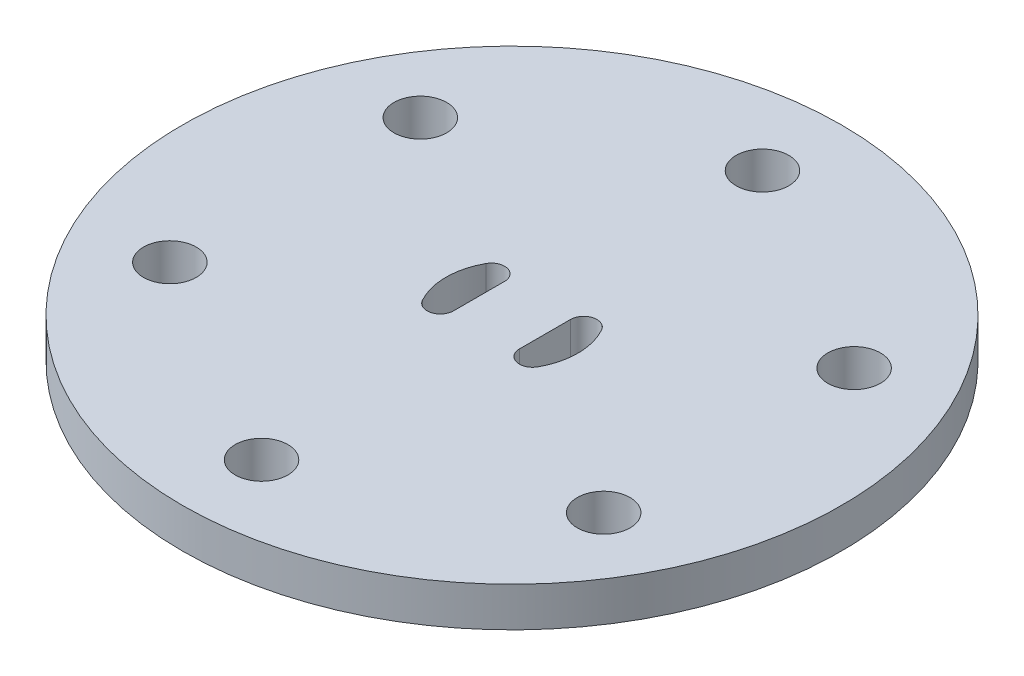
ISO-10303-21;
HEADER;
FILE_DESCRIPTION(('STEP AP214'),'2;1');
FILE_NAME('part.step','',(''),(''),'','','');
FILE_SCHEMA(('AUTOMOTIVE_DESIGN { 1 0 10303 214 1 1 1 1 }'));
ENDSEC;
DATA;
#1=APPLICATION_CONTEXT('core data for automotive mechanical design processes');
#2=APPLICATION_PROTOCOL_DEFINITION('international standard','automotive_design',2000,#1);
#3=PRODUCT_CONTEXT('',#1,'mechanical');
#4=PRODUCT('Part','Part','',(#3));
#5=PRODUCT_RELATED_PRODUCT_CATEGORY('part','',(#4));
#6=PRODUCT_DEFINITION_FORMATION('','',#4);
#7=PRODUCT_DEFINITION_CONTEXT('part definition',#1,'design');
#8=PRODUCT_DEFINITION('design','',#6,#7);
#9=PRODUCT_DEFINITION_SHAPE('','',#8);
#10=(LENGTH_UNIT() NAMED_UNIT(*) SI_UNIT(.MILLI.,.METRE.));
#11=(NAMED_UNIT(*) PLANE_ANGLE_UNIT() SI_UNIT($,.RADIAN.));
#12=(NAMED_UNIT(*) SI_UNIT($,.STERADIAN.) SOLID_ANGLE_UNIT());
#13=UNCERTAINTY_MEASURE_WITH_UNIT(LENGTH_MEASURE(1.E-05),#10,'distance_accuracy_value','');
#14=(GEOMETRIC_REPRESENTATION_CONTEXT(3) GLOBAL_UNCERTAINTY_ASSIGNED_CONTEXT((#13)) GLOBAL_UNIT_ASSIGNED_CONTEXT((#10,
#11,#12)) REPRESENTATION_CONTEXT('',''));
#15=CARTESIAN_POINT('',(0.,0.,0.));
#16=DIRECTION('',(0.,0.,1.));
#17=DIRECTION('',(1.,0.,0.));
#18=AXIS2_PLACEMENT_3D('',#15,#16,#17);
#19=CARTESIAN_POINT('',(0.,3.,0.));
#20=DIRECTION('',(0.,-1.,0.));
#21=DIRECTION('',(0.,0.,-1.));
#22=AXIS2_PLACEMENT_3D('',#19,#20,#21);
#23=CYLINDRICAL_SURFACE('',#22,5.);
#24=CARTESIAN_POINT('',(0.,3.,0.));
#25=DIRECTION('',(0.,1.,0.));
#26=DIRECTION('',(0.,0.,1.));
#27=AXIS2_PLACEMENT_3D('',#24,#25,#26);
#28=CIRCLE('',#27,5.);
#29=CARTESIAN_POINT('',(4.375,3.,2.42061459137964));
#30=VERTEX_POINT('',#29);
#31=CARTESIAN_POINT('',(4.375,3.,-2.42061459137964));
#32=VERTEX_POINT('',#31);
#33=EDGE_CURVE('E111',#30,#32,#28,.T.);
#34=ORIENTED_EDGE('',*,*,#33,.T.);
#35=DIRECTION('',(0.,-1.,0.));
#36=VECTOR('',#35,1.);
#37=CARTESIAN_POINT('',(4.375,3.,-2.42061459137964));
#38=LINE('',#37,#36);
#39=CARTESIAN_POINT('',(4.375,0.,-2.42061459137964));
#40=VERTEX_POINT('',#39);
#41=EDGE_CURVE('E146',#32,#40,#38,.T.);
#42=ORIENTED_EDGE('',*,*,#41,.T.);
#43=CARTESIAN_POINT('',(0.,0.,0.));
#44=DIRECTION('',(0.,1.,0.));
#45=DIRECTION('',(0.,0.,1.));
#46=AXIS2_PLACEMENT_3D('',#43,#44,#45);
#47=CIRCLE('',#46,5.);
#48=CARTESIAN_POINT('',(4.375,0.,2.42061459137964));
#49=VERTEX_POINT('',#48);
#50=EDGE_CURVE('E200',#49,#40,#47,.T.);
#51=ORIENTED_EDGE('',*,*,#50,.F.);
#52=DIRECTION('',(0.,-1.,0.));
#53=VECTOR('',#52,1.);
#54=CARTESIAN_POINT('',(4.375,3.,2.42061459137964));
#55=LINE('',#54,#53);
#56=EDGE_CURVE('E137',#49,#30,#55,.F.);
#57=ORIENTED_EDGE('',*,*,#56,.T.);
#58=EDGE_LOOP('',(#34,#42,#51,#57));
#59=FACE_BOUND('',#58,.T.);
#60=ADVANCED_FACE('F39',(#59),#23,.F.);
#61=CARTESIAN_POINT('',(0.,3.,0.));
#62=DIRECTION('',(0.,1.,0.));
#63=DIRECTION('',(0.,0.,1.));
#64=AXIS2_PLACEMENT_3D('',#61,#62,#63);
#65=PLANE('',#64);
#66=ORIENTED_EDGE('',*,*,#33,.F.);
#67=CARTESIAN_POINT('',(3.5,3.,1.93649167310371));
#68=DIRECTION('',(0.,1.,0.));
#69=DIRECTION('',(0.,0.,1.));
#70=AXIS2_PLACEMENT_3D('',#67,#68,#69);
#71=CIRCLE('',#70,1.);
#72=CARTESIAN_POINT('',(2.5,3.,1.93649167310371));
#73=VERTEX_POINT('',#72);
#74=EDGE_CURVE('E105',#30,#73,#71,.F.);
#75=ORIENTED_EDGE('',*,*,#74,.T.);
#76=DIRECTION('',(0.,0.,-1.));
#77=VECTOR('',#76,1.);
#78=CARTESIAN_POINT('',(2.5,3.,6.));
#79=LINE('',#78,#77);
#80=CARTESIAN_POINT('',(2.5,3.,-1.93649167310371));
#81=VERTEX_POINT('',#80);
#82=EDGE_CURVE('E109',#73,#81,#79,.T.);
#83=ORIENTED_EDGE('',*,*,#82,.T.);
#84=CARTESIAN_POINT('',(3.5,3.,-1.93649167310371));
#85=DIRECTION('',(0.,1.,0.));
#86=DIRECTION('',(0.,0.,1.));
#87=AXIS2_PLACEMENT_3D('',#84,#85,#86);
#88=CIRCLE('',#87,1.);
#89=EDGE_CURVE('E162',#81,#32,#88,.F.);
#90=ORIENTED_EDGE('',*,*,#89,.T.);
#91=EDGE_LOOP('',(#66,#75,#83,#90));
#92=FACE_BOUND('',#91,.T.);
#93=CARTESIAN_POINT('',(-4.375,3.,-2.42061459137963));
#94=VERTEX_POINT('',#93);
#95=CARTESIAN_POINT('',(-4.375,3.,2.42061459137963));
#96=VERTEX_POINT('',#95);
#97=EDGE_CURVE('E195',#94,#96,#28,.T.);
#98=ORIENTED_EDGE('',*,*,#97,.F.);
#99=CARTESIAN_POINT('',(-3.5,3.,-1.93649167310371));
#100=DIRECTION('',(0.,1.,0.));
#101=DIRECTION('',(0.,0.,1.));
#102=AXIS2_PLACEMENT_3D('',#99,#100,#101);
#103=CIRCLE('',#102,1.);
#104=CARTESIAN_POINT('',(-2.5,3.,-1.93649167310371));
#105=VERTEX_POINT('',#104);
#106=EDGE_CURVE('E11',#94,#105,#103,.F.);
#107=ORIENTED_EDGE('',*,*,#106,.T.);
#108=DIRECTION('',(0.,0.,1.));
#109=VECTOR('',#108,1.);
#110=CARTESIAN_POINT('',(-2.5,3.,6.));
#111=LINE('',#110,#109);
#112=CARTESIAN_POINT('',(-2.5,3.,1.93649167310371));
#113=VERTEX_POINT('',#112);
#114=EDGE_CURVE('E129',#105,#113,#111,.T.);
#115=ORIENTED_EDGE('',*,*,#114,.T.);
#116=CARTESIAN_POINT('',(-3.5,3.,1.93649167310371));
#117=DIRECTION('',(0.,1.,0.));
#118=DIRECTION('',(0.,0.,1.));
#119=AXIS2_PLACEMENT_3D('',#116,#117,#118);
#120=CIRCLE('',#119,1.);
#121=EDGE_CURVE('E116',#113,#96,#120,.F.);
#122=ORIENTED_EDGE('',*,*,#121,.T.);
#123=EDGE_LOOP('',(#98,#107,#115,#122));
#124=FACE_BOUND('',#123,.T.);
#125=CARTESIAN_POINT('',(-16.4544826719031,3.,9.50000000000071));
#126=DIRECTION('',(0.,1.,0.));
#127=DIRECTION('',(0.,0.,1.));
#128=AXIS2_PLACEMENT_3D('',#125,#126,#127);
#129=CIRCLE('',#128,2.00000000000154);
#130=CARTESIAN_POINT('',(-16.4544826719031,3.,11.5000000000022));
#131=VERTEX_POINT('',#130);
#132=EDGE_CURVE('E297',#131,#131,#129,.T.);
#133=ORIENTED_EDGE('',*,*,#132,.F.);
#134=EDGE_LOOP('',(#133));
#135=FACE_BOUND('',#134,.T.);
#136=CARTESIAN_POINT('',(16.4544826719055,3.,9.4999999999993));
#137=DIRECTION('',(0.,1.,0.));
#138=DIRECTION('',(0.,0.,1.));
#139=AXIS2_PLACEMENT_3D('',#136,#137,#138);
#140=CIRCLE('',#139,2.00000000000104);
#141=CARTESIAN_POINT('',(16.4544826719055,3.,11.5000000000003));
#142=VERTEX_POINT('',#141);
#143=EDGE_CURVE('E313',#142,#142,#140,.T.);
#144=ORIENTED_EDGE('',*,*,#143,.F.);
#145=EDGE_LOOP('',(#144));
#146=FACE_BOUND('',#145,.T.);
#147=CARTESIAN_POINT('',(0.,3.,0.));
#148=DIRECTION('',(0.,1.,0.));
#149=DIRECTION('',(0.,0.,1.));
#150=AXIS2_PLACEMENT_3D('',#147,#148,#149);
#151=CIRCLE('',#150,25.);
#152=CARTESIAN_POINT('',(0.,3.,25.));
#153=VERTEX_POINT('',#152);
#154=EDGE_CURVE('E133',#153,#153,#151,.T.);
#155=ORIENTED_EDGE('',*,*,#154,.T.);
#156=EDGE_LOOP('',(#155));
#157=FACE_BOUND('',#156,.T.);
#158=CARTESIAN_POINT('',(0.,3.,-19.));
#159=DIRECTION('',(0.,1.,0.));
#160=DIRECTION('',(0.,0.,1.));
#161=AXIS2_PLACEMENT_3D('',#158,#159,#160);
#162=CIRCLE('',#161,2.);
#163=CARTESIAN_POINT('',(0.,3.,-17.));
#164=VERTEX_POINT('',#163);
#165=EDGE_CURVE('E213',#164,#164,#162,.T.);
#166=ORIENTED_EDGE('',*,*,#165,.F.);
#167=EDGE_LOOP('',(#166));
#168=FACE_BOUND('',#167,.T.);
#169=CARTESIAN_POINT('',(16.4544826719047,3.,-9.5000000000007));
#170=DIRECTION('',(0.,1.,0.));
#171=DIRECTION('',(0.,0.,1.));
#172=AXIS2_PLACEMENT_3D('',#169,#170,#171);
#173=CIRCLE('',#172,2.00000000000023);
#174=CARTESIAN_POINT('',(16.4544826719047,3.,-7.50000000000047));
#175=VERTEX_POINT('',#174);
#176=EDGE_CURVE('E212',#175,#175,#173,.T.);
#177=ORIENTED_EDGE('',*,*,#176,.F.);
#178=EDGE_LOOP('',(#177));
#179=FACE_BOUND('',#178,.T.);
#180=CARTESIAN_POINT('',(1.61305695077789E-12,3.,19.));
#181=DIRECTION('',(0.,1.,0.));
#182=DIRECTION('',(0.,0.,1.));
#183=AXIS2_PLACEMENT_3D('',#180,#181,#182);
#184=CIRCLE('',#183,2.00000000000167);
#185=CARTESIAN_POINT('',(1.61305695077789E-12,3.,21.0000000000017));
#186=VERTEX_POINT('',#185);
#187=EDGE_CURVE('E305',#186,#186,#184,.T.);
#188=ORIENTED_EDGE('',*,*,#187,.F.);
#189=EDGE_LOOP('',(#188));
#190=FACE_BOUND('',#189,.T.);
#191=CARTESIAN_POINT('',(-16.4544826719039,3.,-9.49999999999929));
#192=DIRECTION('',(0.,1.,0.));
#193=DIRECTION('',(0.,0.,1.));
#194=AXIS2_PLACEMENT_3D('',#191,#192,#193);
#195=CIRCLE('',#194,2.00000000000081);
#196=CARTESIAN_POINT('',(-16.4544826719039,3.,-7.49999999999847));
#197=VERTEX_POINT('',#196);
#198=EDGE_CURVE('E289',#197,#197,#195,.T.);
#199=ORIENTED_EDGE('',*,*,#198,.F.);
#200=EDGE_LOOP('',(#199));
#201=FACE_BOUND('',#200,.T.);
#202=ADVANCED_FACE('F107',(#92,#124,#135,#146,#157,#168,#179,#190,#201),#65,.T.);
#203=CARTESIAN_POINT('',(0.,0.,0.));
#204=DIRECTION('',(0.,1.,0.));
#205=DIRECTION('',(0.,0.,1.));
#206=AXIS2_PLACEMENT_3D('',#203,#204,#205);
#207=PLANE('',#206);
#208=DIRECTION('',(0.,0.,-1.));
#209=VECTOR('',#208,1.);
#210=CARTESIAN_POINT('',(2.5,0.,6.));
#211=LINE('',#210,#209);
#212=CARTESIAN_POINT('',(2.5,0.,1.93649167310371));
#213=VERTEX_POINT('',#212);
#214=CARTESIAN_POINT('',(2.5,0.,-1.93649167310371));
#215=VERTEX_POINT('',#214);
#216=EDGE_CURVE('E190',#213,#215,#211,.T.);
#217=ORIENTED_EDGE('',*,*,#216,.F.);
#218=CARTESIAN_POINT('',(3.5,0.,1.93649167310371));
#219=DIRECTION('',(0.,1.,0.));
#220=DIRECTION('',(0.,0.,1.));
#221=AXIS2_PLACEMENT_3D('',#218,#219,#220);
#222=CIRCLE('',#221,1.);
#223=EDGE_CURVE('E117',#213,#49,#222,.T.);
#224=ORIENTED_EDGE('',*,*,#223,.T.);
#225=ORIENTED_EDGE('',*,*,#50,.T.);
#226=CARTESIAN_POINT('',(3.5,0.,-1.93649167310371));
#227=DIRECTION('',(0.,1.,0.));
#228=DIRECTION('',(0.,0.,1.));
#229=AXIS2_PLACEMENT_3D('',#226,#227,#228);
#230=CIRCLE('',#229,1.);
#231=EDGE_CURVE('E165',#40,#215,#230,.T.);
#232=ORIENTED_EDGE('',*,*,#231,.T.);
#233=EDGE_LOOP('',(#217,#224,#225,#232));
#234=FACE_BOUND('',#233,.T.);
#235=DIRECTION('',(0.,0.,1.));
#236=VECTOR('',#235,1.);
#237=CARTESIAN_POINT('',(-2.5,0.,6.));
#238=LINE('',#237,#236);
#239=CARTESIAN_POINT('',(-2.5,0.,-1.93649167310371));
#240=VERTEX_POINT('',#239);
#241=CARTESIAN_POINT('',(-2.5,0.,1.93649167310371));
#242=VERTEX_POINT('',#241);
#243=EDGE_CURVE('E179',#240,#242,#238,.T.);
#244=ORIENTED_EDGE('',*,*,#243,.F.);
#245=CARTESIAN_POINT('',(-3.5,0.,-1.93649167310371));
#246=DIRECTION('',(0.,1.,0.));
#247=DIRECTION('',(0.,0.,1.));
#248=AXIS2_PLACEMENT_3D('',#245,#246,#247);
#249=CIRCLE('',#248,1.);
#250=CARTESIAN_POINT('',(-4.375,0.,-2.42061459137963));
#251=VERTEX_POINT('',#250);
#252=EDGE_CURVE('E48',#240,#251,#249,.T.);
#253=ORIENTED_EDGE('',*,*,#252,.T.);
#254=CARTESIAN_POINT('',(-4.375,0.,2.42061459137963));
#255=VERTEX_POINT('',#254);
#256=EDGE_CURVE('E180',#251,#255,#47,.T.);
#257=ORIENTED_EDGE('',*,*,#256,.T.);
#258=CARTESIAN_POINT('',(-3.5,0.,1.93649167310371));
#259=DIRECTION('',(0.,1.,0.));
#260=DIRECTION('',(0.,0.,1.));
#261=AXIS2_PLACEMENT_3D('',#258,#259,#260);
#262=CIRCLE('',#261,1.);
#263=EDGE_CURVE('E172',#255,#242,#262,.T.);
#264=ORIENTED_EDGE('',*,*,#263,.T.);
#265=EDGE_LOOP('',(#244,#253,#257,#264));
#266=FACE_BOUND('',#265,.T.);
#267=CARTESIAN_POINT('',(0.,0.,0.));
#268=DIRECTION('',(0.,1.,0.));
#269=DIRECTION('',(0.,0.,1.));
#270=AXIS2_PLACEMENT_3D('',#267,#268,#269);
#271=CIRCLE('',#270,25.);
#272=CARTESIAN_POINT('',(0.,0.,25.));
#273=VERTEX_POINT('',#272);
#274=EDGE_CURVE('E140',#273,#273,#271,.T.);
#275=ORIENTED_EDGE('',*,*,#274,.F.);
#276=EDGE_LOOP('',(#275));
#277=FACE_BOUND('',#276,.T.);
#278=CARTESIAN_POINT('',(0.,0.,-19.));
#279=DIRECTION('',(0.,1.,0.));
#280=DIRECTION('',(0.,0.,1.));
#281=AXIS2_PLACEMENT_3D('',#278,#279,#280);
#282=CIRCLE('',#281,2.);
#283=CARTESIAN_POINT('',(0.,0.,-17.));
#284=VERTEX_POINT('',#283);
#285=EDGE_CURVE('E204',#284,#284,#282,.T.);
#286=ORIENTED_EDGE('',*,*,#285,.T.);
#287=EDGE_LOOP('',(#286));
#288=FACE_BOUND('',#287,.T.);
#289=CARTESIAN_POINT('',(16.4544826719047,0.,-9.5000000000007));
#290=DIRECTION('',(0.,1.,0.));
#291=DIRECTION('',(0.,0.,1.));
#292=AXIS2_PLACEMENT_3D('',#289,#290,#291);
#293=CIRCLE('',#292,2.00000000000023);
#294=CARTESIAN_POINT('',(16.4544826719047,0.,-7.50000000000047));
#295=VERTEX_POINT('',#294);
#296=EDGE_CURVE('E208',#295,#295,#293,.T.);
#297=ORIENTED_EDGE('',*,*,#296,.T.);
#298=EDGE_LOOP('',(#297));
#299=FACE_BOUND('',#298,.T.);
#300=CARTESIAN_POINT('',(16.4544826719055,0.,9.4999999999993));
#301=DIRECTION('',(0.,1.,0.));
#302=DIRECTION('',(0.,0.,1.));
#303=AXIS2_PLACEMENT_3D('',#300,#301,#302);
#304=CIRCLE('',#303,2.00000000000104);
#305=CARTESIAN_POINT('',(16.4544826719055,0.,11.5000000000003));
#306=VERTEX_POINT('',#305);
#307=EDGE_CURVE('E309',#306,#306,#304,.T.);
#308=ORIENTED_EDGE('',*,*,#307,.T.);
#309=EDGE_LOOP('',(#308));
#310=FACE_BOUND('',#309,.T.);
#311=CARTESIAN_POINT('',(1.61305695077789E-12,0.,19.));
#312=DIRECTION('',(0.,1.,0.));
#313=DIRECTION('',(0.,0.,1.));
#314=AXIS2_PLACEMENT_3D('',#311,#312,#313);
#315=CIRCLE('',#314,2.00000000000167);
#316=CARTESIAN_POINT('',(1.61305695077789E-12,0.,21.0000000000017));
#317=VERTEX_POINT('',#316);
#318=EDGE_CURVE('E301',#317,#317,#315,.T.);
#319=ORIENTED_EDGE('',*,*,#318,.T.);
#320=EDGE_LOOP('',(#319));
#321=FACE_BOUND('',#320,.T.);
#322=CARTESIAN_POINT('',(-16.4544826719031,0.,9.50000000000071));
#323=DIRECTION('',(0.,1.,0.));
#324=DIRECTION('',(0.,0.,1.));
#325=AXIS2_PLACEMENT_3D('',#322,#323,#324);
#326=CIRCLE('',#325,2.00000000000154);
#327=CARTESIAN_POINT('',(-16.4544826719031,0.,11.5000000000022));
#328=VERTEX_POINT('',#327);
#329=EDGE_CURVE('E293',#328,#328,#326,.T.);
#330=ORIENTED_EDGE('',*,*,#329,.T.);
#331=EDGE_LOOP('',(#330));
#332=FACE_BOUND('',#331,.T.);
#333=CARTESIAN_POINT('',(-16.4544826719039,0.,-9.49999999999929));
#334=DIRECTION('',(0.,1.,0.));
#335=DIRECTION('',(0.,0.,1.));
#336=AXIS2_PLACEMENT_3D('',#333,#334,#335);
#337=CIRCLE('',#336,2.00000000000081);
#338=CARTESIAN_POINT('',(-16.4544826719039,0.,-7.49999999999847));
#339=VERTEX_POINT('',#338);
#340=EDGE_CURVE('E189',#339,#339,#337,.T.);
#341=ORIENTED_EDGE('',*,*,#340,.T.);
#342=EDGE_LOOP('',(#341));
#343=FACE_BOUND('',#342,.T.);
#344=ADVANCED_FACE('F177',(#234,#266,#277,#288,#299,#310,#321,#332,#343),#207,.F.);
#345=CARTESIAN_POINT('',(0.,3.,0.));
#346=DIRECTION('',(0.,-1.,0.));
#347=DIRECTION('',(0.,0.,-1.));
#348=AXIS2_PLACEMENT_3D('',#345,#346,#347);
#349=CYLINDRICAL_SURFACE('',#348,25.);
#350=ORIENTED_EDGE('',*,*,#154,.F.);
#351=EDGE_LOOP('',(#350));
#352=FACE_BOUND('',#351,.T.);
#353=ORIENTED_EDGE('',*,*,#274,.T.);
#354=EDGE_LOOP('',(#353));
#355=FACE_BOUND('',#354,.T.);
#356=ADVANCED_FACE('F225',(#352,#355),#349,.T.);
#357=CARTESIAN_POINT('',(0.,3.,-19.));
#358=DIRECTION('',(0.,-1.,0.));
#359=DIRECTION('',(0.,0.,-1.));
#360=AXIS2_PLACEMENT_3D('',#357,#358,#359);
#361=CYLINDRICAL_SURFACE('',#360,2.);
#362=ORIENTED_EDGE('',*,*,#165,.T.);
#363=EDGE_LOOP('',(#362));
#364=FACE_BOUND('',#363,.T.);
#365=ORIENTED_EDGE('',*,*,#285,.F.);
#366=EDGE_LOOP('',(#365));
#367=FACE_BOUND('',#366,.T.);
#368=ADVANCED_FACE('F223',(#364,#367),#361,.F.);
#369=ORIENTED_EDGE('',*,*,#97,.T.);
#370=DIRECTION('',(0.,-1.,0.));
#371=VECTOR('',#370,1.);
#372=CARTESIAN_POINT('',(-4.375,3.,2.42061459137963));
#373=LINE('',#372,#371);
#374=EDGE_CURVE('E55',#96,#255,#373,.T.);
#375=ORIENTED_EDGE('',*,*,#374,.T.);
#376=ORIENTED_EDGE('',*,*,#256,.F.);
#377=DIRECTION('',(0.,-1.,0.));
#378=VECTOR('',#377,1.);
#379=CARTESIAN_POINT('',(-4.375,3.,-2.42061459137963));
#380=LINE('',#379,#378);
#381=EDGE_CURVE('E157',#251,#94,#380,.F.);
#382=ORIENTED_EDGE('',*,*,#381,.T.);
#383=EDGE_LOOP('',(#369,#375,#376,#382));
#384=FACE_BOUND('',#383,.T.);
#385=ADVANCED_FACE('F197',(#384),#23,.F.);
#386=CARTESIAN_POINT('',(16.4544826719047,3.,-9.5000000000007));
#387=DIRECTION('',(0.,-1.,0.));
#388=DIRECTION('',(0.,0.,-1.));
#389=AXIS2_PLACEMENT_3D('',#386,#387,#388);
#390=CYLINDRICAL_SURFACE('',#389,2.00000000000023);
#391=ORIENTED_EDGE('',*,*,#176,.T.);
#392=EDGE_LOOP('',(#391));
#393=FACE_BOUND('',#392,.T.);
#394=ORIENTED_EDGE('',*,*,#296,.F.);
#395=EDGE_LOOP('',(#394));
#396=FACE_BOUND('',#395,.T.);
#397=ADVANCED_FACE('F232',(#393,#396),#390,.F.);
#398=CARTESIAN_POINT('',(16.4544826719055,3.,9.4999999999993));
#399=DIRECTION('',(0.,-1.,0.));
#400=DIRECTION('',(0.,0.,-1.));
#401=AXIS2_PLACEMENT_3D('',#398,#399,#400);
#402=CYLINDRICAL_SURFACE('',#401,2.00000000000104);
#403=ORIENTED_EDGE('',*,*,#143,.T.);
#404=EDGE_LOOP('',(#403));
#405=FACE_BOUND('',#404,.T.);
#406=ORIENTED_EDGE('',*,*,#307,.F.);
#407=EDGE_LOOP('',(#406));
#408=FACE_BOUND('',#407,.T.);
#409=ADVANCED_FACE('F245',(#405,#408),#402,.F.);
#410=CARTESIAN_POINT('',(1.61305695077789E-12,3.,19.));
#411=DIRECTION('',(0.,-1.,0.));
#412=DIRECTION('',(0.,0.,-1.));
#413=AXIS2_PLACEMENT_3D('',#410,#411,#412);
#414=CYLINDRICAL_SURFACE('',#413,2.00000000000167);
#415=ORIENTED_EDGE('',*,*,#187,.T.);
#416=EDGE_LOOP('',(#415));
#417=FACE_BOUND('',#416,.T.);
#418=ORIENTED_EDGE('',*,*,#318,.F.);
#419=EDGE_LOOP('',(#418));
#420=FACE_BOUND('',#419,.T.);
#421=ADVANCED_FACE('F249',(#417,#420),#414,.F.);
#422=CARTESIAN_POINT('',(-16.4544826719031,3.,9.50000000000071));
#423=DIRECTION('',(0.,-1.,0.));
#424=DIRECTION('',(0.,0.,-1.));
#425=AXIS2_PLACEMENT_3D('',#422,#423,#424);
#426=CYLINDRICAL_SURFACE('',#425,2.00000000000154);
#427=ORIENTED_EDGE('',*,*,#132,.T.);
#428=EDGE_LOOP('',(#427));
#429=FACE_BOUND('',#428,.T.);
#430=ORIENTED_EDGE('',*,*,#329,.F.);
#431=EDGE_LOOP('',(#430));
#432=FACE_BOUND('',#431,.T.);
#433=ADVANCED_FACE('F253',(#429,#432),#426,.F.);
#434=CARTESIAN_POINT('',(-16.4544826719039,3.,-9.49999999999929));
#435=DIRECTION('',(0.,-1.,0.));
#436=DIRECTION('',(0.,0.,-1.));
#437=AXIS2_PLACEMENT_3D('',#434,#435,#436);
#438=CYLINDRICAL_SURFACE('',#437,2.00000000000081);
#439=ORIENTED_EDGE('',*,*,#198,.T.);
#440=EDGE_LOOP('',(#439));
#441=FACE_BOUND('',#440,.T.);
#442=ORIENTED_EDGE('',*,*,#340,.F.);
#443=EDGE_LOOP('',(#442));
#444=FACE_BOUND('',#443,.T.);
#445=ADVANCED_FACE('F257',(#441,#444),#438,.F.);
#446=CARTESIAN_POINT('',(2.5,0.,6.));
#447=DIRECTION('',(1.,0.,0.));
#448=DIRECTION('',(0.,0.,-1.));
#449=AXIS2_PLACEMENT_3D('',#446,#447,#448);
#450=PLANE('',#449);
#451=ORIENTED_EDGE('',*,*,#216,.T.);
#452=DIRECTION('',(0.,1.,0.));
#453=VECTOR('',#452,1.);
#454=CARTESIAN_POINT('',(2.5,3.,-1.93649167310371));
#455=LINE('',#454,#453);
#456=EDGE_CURVE('E127',#215,#81,#455,.T.);
#457=ORIENTED_EDGE('',*,*,#456,.T.);
#458=ORIENTED_EDGE('',*,*,#82,.F.);
#459=DIRECTION('',(0.,1.,0.));
#460=VECTOR('',#459,1.);
#461=CARTESIAN_POINT('',(2.5,0.,1.93649167310371));
#462=LINE('',#461,#460);
#463=EDGE_CURVE('E124',#73,#213,#462,.F.);
#464=ORIENTED_EDGE('',*,*,#463,.T.);
#465=EDGE_LOOP('',(#451,#457,#458,#464));
#466=FACE_BOUND('',#465,.T.);
#467=ADVANCED_FACE('F123',(#466),#450,.T.);
#468=CARTESIAN_POINT('',(-2.5,0.,6.));
#469=DIRECTION('',(-1.,0.,0.));
#470=DIRECTION('',(0.,0.,1.));
#471=AXIS2_PLACEMENT_3D('',#468,#469,#470);
#472=PLANE('',#471);
#473=ORIENTED_EDGE('',*,*,#243,.T.);
#474=DIRECTION('',(0.,1.,0.));
#475=VECTOR('',#474,1.);
#476=CARTESIAN_POINT('',(-2.5,3.,1.93649167310371));
#477=LINE('',#476,#475);
#478=EDGE_CURVE('E153',#242,#113,#477,.T.);
#479=ORIENTED_EDGE('',*,*,#478,.T.);
#480=ORIENTED_EDGE('',*,*,#114,.F.);
#481=DIRECTION('',(0.,1.,0.));
#482=VECTOR('',#481,1.);
#483=CARTESIAN_POINT('',(-2.5,0.,-1.93649167310371));
#484=LINE('',#483,#482);
#485=EDGE_CURVE('E149',#105,#240,#484,.F.);
#486=ORIENTED_EDGE('',*,*,#485,.T.);
#487=EDGE_LOOP('',(#473,#479,#480,#486));
#488=FACE_BOUND('',#487,.T.);
#489=ADVANCED_FACE('F184',(#488),#472,.T.);
#490=CARTESIAN_POINT('',(3.5,3.,-1.93649167310371));
#491=DIRECTION('',(0.,-1.,0.));
#492=DIRECTION('',(0.,0.,-1.));
#493=AXIS2_PLACEMENT_3D('',#490,#491,#492);
#494=CYLINDRICAL_SURFACE('',#493,1.);
#495=ORIENTED_EDGE('',*,*,#231,.F.);
#496=ORIENTED_EDGE('',*,*,#41,.F.);
#497=ORIENTED_EDGE('',*,*,#89,.F.);
#498=ORIENTED_EDGE('',*,*,#456,.F.);
#499=EDGE_LOOP('',(#495,#496,#497,#498));
#500=FACE_BOUND('',#499,.T.);
#501=ADVANCED_FACE('F265',(#500),#494,.F.);
#502=CARTESIAN_POINT('',(3.5,3.,1.93649167310371));
#503=DIRECTION('',(0.,-1.,0.));
#504=DIRECTION('',(0.,0.,-1.));
#505=AXIS2_PLACEMENT_3D('',#502,#503,#504);
#506=CYLINDRICAL_SURFACE('',#505,1.);
#507=ORIENTED_EDGE('',*,*,#74,.F.);
#508=ORIENTED_EDGE('',*,*,#56,.F.);
#509=ORIENTED_EDGE('',*,*,#223,.F.);
#510=ORIENTED_EDGE('',*,*,#463,.F.);
#511=EDGE_LOOP('',(#507,#508,#509,#510));
#512=FACE_BOUND('',#511,.T.);
#513=ADVANCED_FACE('F131',(#512),#506,.F.);
#514=CARTESIAN_POINT('',(-3.5,3.,1.93649167310371));
#515=DIRECTION('',(0.,-1.,0.));
#516=DIRECTION('',(0.,0.,-1.));
#517=AXIS2_PLACEMENT_3D('',#514,#515,#516);
#518=CYLINDRICAL_SURFACE('',#517,1.);
#519=ORIENTED_EDGE('',*,*,#263,.F.);
#520=ORIENTED_EDGE('',*,*,#374,.F.);
#521=ORIENTED_EDGE('',*,*,#121,.F.);
#522=ORIENTED_EDGE('',*,*,#478,.F.);
#523=EDGE_LOOP('',(#519,#520,#521,#522));
#524=FACE_BOUND('',#523,.T.);
#525=ADVANCED_FACE('F192',(#524),#518,.F.);
#526=CARTESIAN_POINT('',(-3.5,3.,-1.93649167310371));
#527=DIRECTION('',(0.,-1.,0.));
#528=DIRECTION('',(0.,0.,-1.));
#529=AXIS2_PLACEMENT_3D('',#526,#527,#528);
#530=CYLINDRICAL_SURFACE('',#529,1.);
#531=ORIENTED_EDGE('',*,*,#106,.F.);
#532=ORIENTED_EDGE('',*,*,#381,.F.);
#533=ORIENTED_EDGE('',*,*,#252,.F.);
#534=ORIENTED_EDGE('',*,*,#485,.F.);
#535=EDGE_LOOP('',(#531,#532,#533,#534));
#536=FACE_BOUND('',#535,.T.);
#537=ADVANCED_FACE('F41',(#536),#530,.F.);
#538=CLOSED_SHELL('',(#60,#202,#344,#356,#368,#385,#397,#409,#421,#433,#445,#467,#489,#501,#513,
#525,#537));
#539=MANIFOLD_SOLID_BREP('B2',#538);
#540=ADVANCED_BREP_SHAPE_REPRESENTATION('',(#18,#539),#14);
#541=SHAPE_DEFINITION_REPRESENTATION(#9,#540);
ENDSEC;
END-ISO-10303-21;
